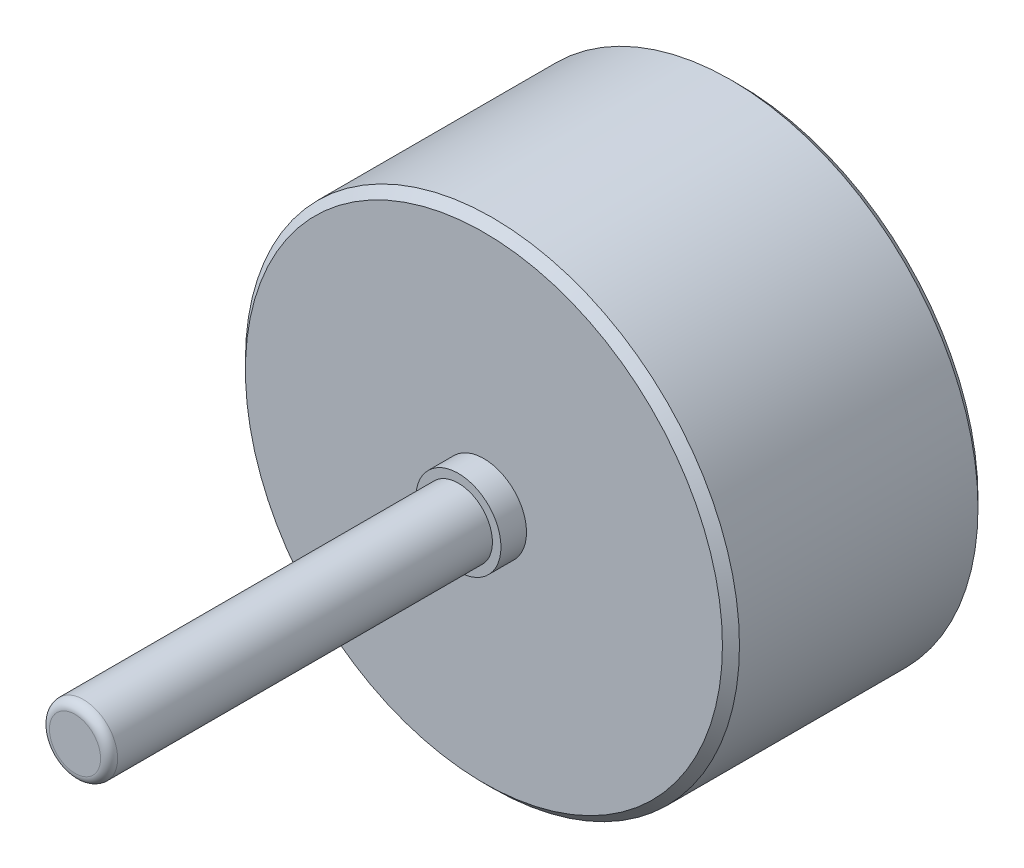
ISO-10303-21;
HEADER;
FILE_DESCRIPTION(('STEP AP214'),'2;1');
FILE_NAME('part.step','',(''),(''),'','','');
FILE_SCHEMA(('AUTOMOTIVE_DESIGN { 1 0 10303 214 1 1 1 1 }'));
ENDSEC;
DATA;
#1=APPLICATION_CONTEXT('core data for automotive mechanical design processes');
#2=APPLICATION_PROTOCOL_DEFINITION('international standard','automotive_design',2000,#1);
#3=PRODUCT_CONTEXT('',#1,'mechanical');
#4=PRODUCT('Part','Part','',(#3));
#5=PRODUCT_RELATED_PRODUCT_CATEGORY('part','',(#4));
#6=PRODUCT_DEFINITION_FORMATION('','',#4);
#7=PRODUCT_DEFINITION_CONTEXT('part definition',#1,'design');
#8=PRODUCT_DEFINITION('design','',#6,#7);
#9=PRODUCT_DEFINITION_SHAPE('','',#8);
#10=(LENGTH_UNIT() NAMED_UNIT(*) SI_UNIT(.MILLI.,.METRE.));
#11=(NAMED_UNIT(*) PLANE_ANGLE_UNIT() SI_UNIT($,.RADIAN.));
#12=(NAMED_UNIT(*) SI_UNIT($,.STERADIAN.) SOLID_ANGLE_UNIT());
#13=UNCERTAINTY_MEASURE_WITH_UNIT(LENGTH_MEASURE(1.E-05),#10,'distance_accuracy_value','');
#14=(GEOMETRIC_REPRESENTATION_CONTEXT(3) GLOBAL_UNCERTAINTY_ASSIGNED_CONTEXT((#13)) GLOBAL_UNIT_ASSIGNED_CONTEXT((#10,
#11,#12)) REPRESENTATION_CONTEXT('',''));
#15=CARTESIAN_POINT('',(0.,0.,0.));
#16=DIRECTION('',(0.,0.,1.));
#17=DIRECTION('',(1.,0.,0.));
#18=AXIS2_PLACEMENT_3D('',#15,#16,#17);
#19=CARTESIAN_POINT('',(0.,0.,30.));
#20=DIRECTION('',(0.,0.,-1.));
#21=DIRECTION('',(-1.,0.,0.));
#22=AXIS2_PLACEMENT_3D('',#19,#20,#21);
#23=CYLINDRICAL_SURFACE('',#22,29.);
#24=CARTESIAN_POINT('',(0.,0.,29.));
#25=DIRECTION('',(0.,0.,1.));
#26=DIRECTION('',(1.,0.,0.));
#27=AXIS2_PLACEMENT_3D('',#24,#25,#26);
#28=CIRCLE('',#27,29.);
#29=CARTESIAN_POINT('',(29.,0.,29.));
#30=VERTEX_POINT('',#29);
#31=EDGE_CURVE('E62',#30,#30,#28,.F.);
#32=ORIENTED_EDGE('',*,*,#31,.T.);
#33=EDGE_LOOP('',(#32));
#34=FACE_BOUND('',#33,.T.);
#35=CARTESIAN_POINT('',(0.,0.,1.));
#36=DIRECTION('',(0.,0.,1.));
#37=DIRECTION('',(1.,0.,0.));
#38=AXIS2_PLACEMENT_3D('',#35,#36,#37);
#39=CIRCLE('',#38,29.);
#40=CARTESIAN_POINT('',(29.,0.,1.));
#41=VERTEX_POINT('',#40);
#42=EDGE_CURVE('E67',#41,#41,#39,.T.);
#43=ORIENTED_EDGE('',*,*,#42,.T.);
#44=EDGE_LOOP('',(#43));
#45=FACE_BOUND('',#44,.T.);
#46=ADVANCED_FACE('F47',(#34,#45),#23,.T.);
#47=CARTESIAN_POINT('',(0.,0.,30.));
#48=DIRECTION('',(0.,0.,1.));
#49=DIRECTION('',(1.,0.,0.));
#50=AXIS2_PLACEMENT_3D('',#47,#48,#49);
#51=PLANE('',#50);
#52=CARTESIAN_POINT('',(0.,0.,30.));
#53=DIRECTION('',(0.,0.,1.));
#54=DIRECTION('',(1.,0.,0.));
#55=AXIS2_PLACEMENT_3D('',#52,#53,#54);
#56=CIRCLE('',#55,28.);
#57=CARTESIAN_POINT('',(28.,0.,30.));
#58=VERTEX_POINT('',#57);
#59=EDGE_CURVE('E70',#58,#58,#56,.T.);
#60=ORIENTED_EDGE('',*,*,#59,.T.);
#61=EDGE_LOOP('',(#60));
#62=FACE_BOUND('',#61,.T.);
#63=CARTESIAN_POINT('',(0.,0.,30.));
#64=DIRECTION('',(0.,0.,1.));
#65=DIRECTION('',(1.,0.,0.));
#66=AXIS2_PLACEMENT_3D('',#63,#64,#65);
#67=CIRCLE('',#66,5.);
#68=CARTESIAN_POINT('',(5.,0.,30.));
#69=VERTEX_POINT('',#68);
#70=EDGE_CURVE('E77',#69,#69,#67,.T.);
#71=ORIENTED_EDGE('',*,*,#70,.F.);
#72=EDGE_LOOP('',(#71));
#73=FACE_BOUND('',#72,.T.);
#74=ADVANCED_FACE('F101',(#62,#73),#51,.T.);
#75=CARTESIAN_POINT('',(0.,0.,0.));
#76=DIRECTION('',(0.,0.,1.));
#77=DIRECTION('',(1.,0.,0.));
#78=AXIS2_PLACEMENT_3D('',#75,#76,#77);
#79=PLANE('',#78);
#80=CARTESIAN_POINT('',(0.,0.,0.));
#81=DIRECTION('',(0.,0.,1.));
#82=DIRECTION('',(1.,0.,0.));
#83=AXIS2_PLACEMENT_3D('',#80,#81,#82);
#84=CIRCLE('',#83,28.);
#85=CARTESIAN_POINT('',(28.,0.,0.));
#86=VERTEX_POINT('',#85);
#87=EDGE_CURVE('E58',#86,#86,#84,.F.);
#88=ORIENTED_EDGE('',*,*,#87,.T.);
#89=EDGE_LOOP('',(#88));
#90=FACE_BOUND('',#89,.T.);
#91=CARTESIAN_POINT('',(0.,0.,0.));
#92=DIRECTION('',(0.,0.,-1.));
#93=DIRECTION('',(-1.,0.,0.));
#94=AXIS2_PLACEMENT_3D('',#91,#92,#93);
#95=CIRCLE('',#94,4.);
#96=CARTESIAN_POINT('',(-4.,0.,0.));
#97=VERTEX_POINT('',#96);
#98=EDGE_CURVE('E83',#97,#97,#95,.T.);
#99=ORIENTED_EDGE('',*,*,#98,.F.);
#100=EDGE_LOOP('',(#99));
#101=FACE_BOUND('',#100,.T.);
#102=ADVANCED_FACE('F98',(#90,#101),#79,.F.);
#103=CARTESIAN_POINT('',(0.,0.,33.));
#104=DIRECTION('',(0.,0.,-1.));
#105=DIRECTION('',(-1.,0.,0.));
#106=AXIS2_PLACEMENT_3D('',#103,#104,#105);
#107=CYLINDRICAL_SURFACE('',#106,5.);
#108=CARTESIAN_POINT('',(0.,0.,33.));
#109=DIRECTION('',(0.,0.,1.));
#110=DIRECTION('',(1.,0.,0.));
#111=AXIS2_PLACEMENT_3D('',#108,#109,#110);
#112=CIRCLE('',#111,5.);
#113=CARTESIAN_POINT('',(5.,0.,33.));
#114=VERTEX_POINT('',#113);
#115=EDGE_CURVE('E76',#114,#114,#112,.T.);
#116=ORIENTED_EDGE('',*,*,#115,.F.);
#117=EDGE_LOOP('',(#116));
#118=FACE_BOUND('',#117,.T.);
#119=ORIENTED_EDGE('',*,*,#70,.T.);
#120=EDGE_LOOP('',(#119));
#121=FACE_BOUND('',#120,.T.);
#122=ADVANCED_FACE('F100',(#118,#121),#107,.T.);
#123=CARTESIAN_POINT('',(0.,0.,33.));
#124=DIRECTION('',(0.,0.,1.));
#125=DIRECTION('',(1.,0.,0.));
#126=AXIS2_PLACEMENT_3D('',#123,#124,#125);
#127=PLANE('',#126);
#128=CARTESIAN_POINT('',(0.,0.,33.));
#129=DIRECTION('',(0.,0.,1.));
#130=DIRECTION('',(1.,0.,0.));
#131=AXIS2_PLACEMENT_3D('',#128,#129,#130);
#132=CIRCLE('',#131,4.);
#133=CARTESIAN_POINT('',(4.,0.,33.));
#134=VERTEX_POINT('',#133);
#135=EDGE_CURVE('E73',#134,#134,#132,.T.);
#136=ORIENTED_EDGE('',*,*,#135,.F.);
#137=EDGE_LOOP('',(#136));
#138=FACE_BOUND('',#137,.T.);
#139=ORIENTED_EDGE('',*,*,#115,.T.);
#140=EDGE_LOOP('',(#139));
#141=FACE_BOUND('',#140,.T.);
#142=ADVANCED_FACE('F108',(#138,#141),#127,.T.);
#143=CARTESIAN_POINT('',(0.,0.,40.));
#144=DIRECTION('',(0.,0.,-1.));
#145=DIRECTION('',(-1.,0.,0.));
#146=AXIS2_PLACEMENT_3D('',#143,#144,#145);
#147=CYLINDRICAL_SURFACE('',#146,4.);
#148=CARTESIAN_POINT('',(0.,0.,77.));
#149=DIRECTION('',(0.,0.,1.));
#150=DIRECTION('',(1.,0.,0.));
#151=AXIS2_PLACEMENT_3D('',#148,#149,#150);
#152=CIRCLE('',#151,4.);
#153=CARTESIAN_POINT('',(4.,0.,77.));
#154=VERTEX_POINT('',#153);
#155=EDGE_CURVE('E12',#154,#154,#152,.F.);
#156=ORIENTED_EDGE('',*,*,#155,.T.);
#157=EDGE_LOOP('',(#156));
#158=FACE_BOUND('',#157,.T.);
#159=ORIENTED_EDGE('',*,*,#135,.T.);
#160=EDGE_LOOP('',(#159));
#161=FACE_BOUND('',#160,.T.);
#162=ADVANCED_FACE('F94',(#158,#161),#147,.T.);
#163=CARTESIAN_POINT('',(0.,0.,5.));
#164=DIRECTION('',(0.,0.,-1.));
#165=DIRECTION('',(-1.,0.,0.));
#166=AXIS2_PLACEMENT_3D('',#163,#164,#165);
#167=CYLINDRICAL_SURFACE('',#166,4.);
#168=CARTESIAN_POINT('',(0.,0.,5.));
#169=DIRECTION('',(0.,0.,-1.));
#170=DIRECTION('',(-1.,0.,0.));
#171=AXIS2_PLACEMENT_3D('',#168,#169,#170);
#172=CIRCLE('',#171,4.);
#173=CARTESIAN_POINT('',(-4.,0.,5.));
#174=VERTEX_POINT('',#173);
#175=EDGE_CURVE('E80',#174,#174,#172,.T.);
#176=ORIENTED_EDGE('',*,*,#175,.F.);
#177=EDGE_LOOP('',(#176));
#178=FACE_BOUND('',#177,.T.);
#179=ORIENTED_EDGE('',*,*,#98,.T.);
#180=EDGE_LOOP('',(#179));
#181=FACE_BOUND('',#180,.T.);
#182=ADVANCED_FACE('F91',(#178,#181),#167,.F.);
#183=CARTESIAN_POINT('',(0.,0.,5.));
#184=DIRECTION('',(0.,0.,-1.));
#185=DIRECTION('',(-1.,0.,0.));
#186=AXIS2_PLACEMENT_3D('',#183,#184,#185);
#187=PLANE('',#186);
#188=ORIENTED_EDGE('',*,*,#175,.T.);
#189=EDGE_LOOP('',(#188));
#190=FACE_BOUND('',#189,.T.);
#191=ADVANCED_FACE('F89',(#190),#187,.T.);
#192=CARTESIAN_POINT('',(0.,0.,30.));
#193=DIRECTION('',(0.,0.,-1.));
#194=DIRECTION('',(-1.,0.,0.));
#195=AXIS2_PLACEMENT_3D('',#192,#193,#194);
#196=CONICAL_SURFACE('',#195,28.,0.785398163397445);
#197=ORIENTED_EDGE('',*,*,#31,.F.);
#198=EDGE_LOOP('',(#197));
#199=FACE_BOUND('',#198,.T.);
#200=ORIENTED_EDGE('',*,*,#59,.F.);
#201=EDGE_LOOP('',(#200));
#202=FACE_BOUND('',#201,.T.);
#203=ADVANCED_FACE('F120',(#199,#202),#196,.T.);
#204=CARTESIAN_POINT('',(0.,0.,1.));
#205=DIRECTION('',(0.,0.,1.));
#206=DIRECTION('',(1.,0.,0.));
#207=AXIS2_PLACEMENT_3D('',#204,#205,#206);
#208=CONICAL_SURFACE('',#207,29.,0.78539816339745);
#209=ORIENTED_EDGE('',*,*,#87,.F.);
#210=EDGE_LOOP('',(#209));
#211=FACE_BOUND('',#210,.T.);
#212=ORIENTED_EDGE('',*,*,#42,.F.);
#213=EDGE_LOOP('',(#212));
#214=FACE_BOUND('',#213,.T.);
#215=ADVANCED_FACE('F122',(#211,#214),#208,.T.);
#216=CARTESIAN_POINT('',(0.,0.,78.));
#217=DIRECTION('',(0.,0.,1.));
#218=DIRECTION('',(1.,0.,0.));
#219=AXIS2_PLACEMENT_3D('',#216,#217,#218);
#220=PLANE('',#219);
#221=CARTESIAN_POINT('',(0.,0.,78.));
#222=DIRECTION('',(0.,0.,1.));
#223=DIRECTION('',(1.,0.,0.));
#224=AXIS2_PLACEMENT_3D('',#221,#222,#223);
#225=CIRCLE('',#224,3.);
#226=CARTESIAN_POINT('',(3.,0.,78.));
#227=VERTEX_POINT('',#226);
#228=EDGE_CURVE('E54',#227,#227,#225,.T.);
#229=ORIENTED_EDGE('',*,*,#228,.T.);
#230=EDGE_LOOP('',(#229));
#231=FACE_BOUND('',#230,.T.);
#232=ADVANCED_FACE('F125',(#231),#220,.T.);
#233=CARTESIAN_POINT('',(0.,0.,77.));
#234=DIRECTION('',(0.,0.,1.));
#235=DIRECTION('',(1.,0.,0.));
#236=AXIS2_PLACEMENT_3D('',#233,#234,#235);
#237=TOROIDAL_SURFACE('',#236,3.,1.);
#238=ORIENTED_EDGE('',*,*,#155,.F.);
#239=EDGE_LOOP('',(#238));
#240=FACE_BOUND('',#239,.T.);
#241=ORIENTED_EDGE('',*,*,#228,.F.);
#242=EDGE_LOOP('',(#241));
#243=FACE_BOUND('',#242,.T.);
#244=ADVANCED_FACE('F49',(#240,#243),#237,.T.);
#245=CLOSED_SHELL('',(#46,#74,#102,#122,#142,#162,#182,#191,#203,#215,#232,#244));
#246=MANIFOLD_SOLID_BREP('B2',#245);
#247=ADVANCED_BREP_SHAPE_REPRESENTATION('',(#18,#246),#14);
#248=SHAPE_DEFINITION_REPRESENTATION(#9,#247);
ENDSEC;
END-ISO-10303-21;
